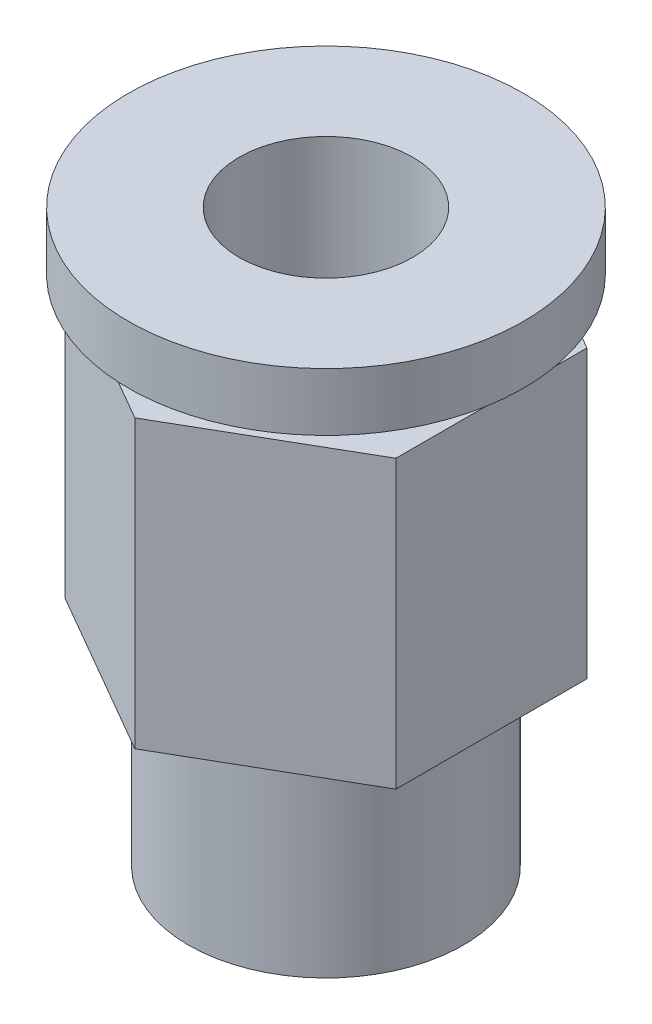
ISO-10303-21;
HEADER;
FILE_DESCRIPTION(('STEP AP214'),'2;1');
FILE_NAME('part.step','',(''),(''),'','','');
FILE_SCHEMA(('AUTOMOTIVE_DESIGN { 1 0 10303 214 1 1 1 1 }'));
ENDSEC;
DATA;
#1=APPLICATION_CONTEXT('core data for automotive mechanical design processes');
#2=APPLICATION_PROTOCOL_DEFINITION('international standard','automotive_design',2000,#1);
#3=PRODUCT_CONTEXT('',#1,'mechanical');
#4=PRODUCT('Part','Part','',(#3));
#5=PRODUCT_RELATED_PRODUCT_CATEGORY('part','',(#4));
#6=PRODUCT_DEFINITION_FORMATION('','',#4);
#7=PRODUCT_DEFINITION_CONTEXT('part definition',#1,'design');
#8=PRODUCT_DEFINITION('design','',#6,#7);
#9=PRODUCT_DEFINITION_SHAPE('','',#8);
#10=(LENGTH_UNIT() NAMED_UNIT(*) SI_UNIT(.MILLI.,.METRE.));
#11=(NAMED_UNIT(*) PLANE_ANGLE_UNIT() SI_UNIT($,.RADIAN.));
#12=(NAMED_UNIT(*) SI_UNIT($,.STERADIAN.) SOLID_ANGLE_UNIT());
#13=UNCERTAINTY_MEASURE_WITH_UNIT(LENGTH_MEASURE(1.E-05),#10,'distance_accuracy_value','');
#14=(GEOMETRIC_REPRESENTATION_CONTEXT(3) GLOBAL_UNCERTAINTY_ASSIGNED_CONTEXT((#13)) GLOBAL_UNIT_ASSIGNED_CONTEXT((#10,
#11,#12)) REPRESENTATION_CONTEXT('',''));
#15=CARTESIAN_POINT('',(0.,0.,0.));
#16=DIRECTION('',(0.,0.,1.));
#17=DIRECTION('',(1.,0.,0.));
#18=AXIS2_PLACEMENT_3D('',#15,#16,#17);
#19=CARTESIAN_POINT('',(-4.75,6.8,0.));
#20=DIRECTION('',(0.,1.,0.));
#21=DIRECTION('',(0.,0.,1.));
#22=AXIS2_PLACEMENT_3D('',#19,#20,#21);
#23=PLANE('',#22);
#24=CARTESIAN_POINT('',(0.,6.8,0.));
#25=DIRECTION('',(0.,-1.,0.));
#26=DIRECTION('',(0.,0.,-1.));
#27=AXIS2_PLACEMENT_3D('',#24,#25,#26);
#28=CIRCLE('',#27,4.75);
#29=CARTESIAN_POINT('',(0.,6.8,-4.75));
#30=VERTEX_POINT('',#29);
#31=EDGE_CURVE('E65',#30,#30,#28,.T.);
#32=ORIENTED_EDGE('',*,*,#31,.F.);
#33=EDGE_LOOP('',(#32));
#34=FACE_BOUND('',#33,.T.);
#35=DIRECTION('',(0.,0.,-1.));
#36=VECTOR('',#35,1.);
#37=CARTESIAN_POINT('',(-5.71576766497729,6.8,0.));
#38=LINE('',#37,#36);
#39=CARTESIAN_POINT('',(-5.7157676649773,6.8,3.29999999999999));
#40=VERTEX_POINT('',#39);
#41=CARTESIAN_POINT('',(-5.71576766497728,6.8,-3.30000000000003));
#42=VERTEX_POINT('',#41);
#43=EDGE_CURVE('E110',#40,#42,#38,.T.);
#44=ORIENTED_EDGE('',*,*,#43,.T.);
#45=DIRECTION('',(0.866025403784442,0.,-0.499999999999995));
#46=VECTOR('',#45,1.);
#47=CARTESIAN_POINT('',(-2.85788383248862,6.8,-4.95000000000001));
#48=LINE('',#47,#46);
#49=CARTESIAN_POINT('',(0.,6.8,-6.6));
#50=VERTEX_POINT('',#49);
#51=EDGE_CURVE('E116',#42,#50,#48,.T.);
#52=ORIENTED_EDGE('',*,*,#51,.T.);
#53=DIRECTION('',(0.866025403784435,0.,0.500000000000007));
#54=VECTOR('',#53,1.);
#55=CARTESIAN_POINT('',(2.85788383248869,6.8,-4.94999999999997));
#56=LINE('',#55,#54);
#57=CARTESIAN_POINT('',(5.71576766497732,6.8,-3.29999999999995));
#58=VERTEX_POINT('',#57);
#59=EDGE_CURVE('E309',#50,#58,#56,.T.);
#60=ORIENTED_EDGE('',*,*,#59,.T.);
#61=DIRECTION('',(0.,0.,1.));
#62=VECTOR('',#61,1.);
#63=CARTESIAN_POINT('',(5.71576766497729,6.8,0.));
#64=LINE('',#63,#62);
#65=CARTESIAN_POINT('',(5.71576766497726,6.8,3.30000000000007));
#66=VERTEX_POINT('',#65);
#67=EDGE_CURVE('E146',#58,#66,#64,.T.);
#68=ORIENTED_EDGE('',*,*,#67,.T.);
#69=DIRECTION('',(-0.866025403784442,0.,0.499999999999995));
#70=VECTOR('',#69,1.);
#71=CARTESIAN_POINT('',(2.85788383248863,6.8,4.95000000000003));
#72=LINE('',#71,#70);
#73=CARTESIAN_POINT('',(0.,6.8,6.6));
#74=VERTEX_POINT('',#73);
#75=EDGE_CURVE('E80',#66,#74,#72,.T.);
#76=ORIENTED_EDGE('',*,*,#75,.T.);
#77=DIRECTION('',(-0.866025403784438,0.,-0.500000000000001));
#78=VECTOR('',#77,1.);
#79=CARTESIAN_POINT('',(-2.85788383248865,6.8,4.94999999999999));
#80=LINE('',#79,#78);
#81=EDGE_CURVE('E124',#74,#40,#80,.T.);
#82=ORIENTED_EDGE('',*,*,#81,.T.);
#83=EDGE_LOOP('',(#44,#52,#60,#68,#76,#82));
#84=FACE_BOUND('',#83,.T.);
#85=ADVANCED_FACE('F57',(#34,#84),#23,.F.);
#86=CARTESIAN_POINT('',(-6.6,16.7,0.));
#87=DIRECTION('',(0.,-1.,0.));
#88=DIRECTION('',(0.,0.,-1.));
#89=AXIS2_PLACEMENT_3D('',#86,#87,#88);
#90=PLANE('',#89);
#91=CARTESIAN_POINT('',(0.,16.7,0.));
#92=DIRECTION('',(0.,-1.,0.));
#93=DIRECTION('',(0.,0.,-1.));
#94=AXIS2_PLACEMENT_3D('',#91,#92,#93);
#95=CIRCLE('',#94,4.);
#96=CARTESIAN_POINT('',(0.,16.7,-4.));
#97=VERTEX_POINT('',#96);
#98=EDGE_CURVE('E167',#97,#97,#95,.T.);
#99=ORIENTED_EDGE('',*,*,#98,.T.);
#100=EDGE_LOOP('',(#99));
#101=FACE_BOUND('',#100,.T.);
#102=DIRECTION('',(0.,0.,1.));
#103=VECTOR('',#102,1.);
#104=CARTESIAN_POINT('',(-5.71576766497729,16.7,0.));
#105=LINE('',#104,#103);
#106=CARTESIAN_POINT('',(-5.71576766497728,16.7,-3.30000000000003));
#107=VERTEX_POINT('',#106);
#108=CARTESIAN_POINT('',(-5.7157676649773,16.7,3.29999999999999));
#109=VERTEX_POINT('',#108);
#110=EDGE_CURVE('E72',#107,#109,#105,.T.);
#111=ORIENTED_EDGE('',*,*,#110,.T.);
#112=DIRECTION('',(0.866025403784438,0.,0.500000000000001));
#113=VECTOR('',#112,1.);
#114=CARTESIAN_POINT('',(-2.85788383248865,16.7,4.94999999999999));
#115=LINE('',#114,#113);
#116=CARTESIAN_POINT('',(0.,16.7,6.6));
#117=VERTEX_POINT('',#116);
#118=EDGE_CURVE('E143',#109,#117,#115,.T.);
#119=ORIENTED_EDGE('',*,*,#118,.T.);
#120=DIRECTION('',(0.866025403784442,0.,-0.499999999999995));
#121=VECTOR('',#120,1.);
#122=CARTESIAN_POINT('',(2.85788383248863,16.7,4.95000000000003));
#123=LINE('',#122,#121);
#124=CARTESIAN_POINT('',(5.71576766497726,16.7,3.30000000000007));
#125=VERTEX_POINT('',#124);
#126=EDGE_CURVE('E313',#117,#125,#123,.T.);
#127=ORIENTED_EDGE('',*,*,#126,.T.);
#128=DIRECTION('',(0.,0.,-1.));
#129=VECTOR('',#128,1.);
#130=CARTESIAN_POINT('',(5.71576766497729,16.7,0.));
#131=LINE('',#130,#129);
#132=CARTESIAN_POINT('',(5.71576766497732,16.7,-3.29999999999995));
#133=VERTEX_POINT('',#132);
#134=EDGE_CURVE('E130',#125,#133,#131,.T.);
#135=ORIENTED_EDGE('',*,*,#134,.T.);
#136=DIRECTION('',(-0.866025403784435,0.,-0.500000000000007));
#137=VECTOR('',#136,1.);
#138=CARTESIAN_POINT('',(2.85788383248869,16.7,-4.94999999999997));
#139=LINE('',#138,#137);
#140=CARTESIAN_POINT('',(0.,16.7,-6.6));
#141=VERTEX_POINT('',#140);
#142=EDGE_CURVE('E125',#133,#141,#139,.T.);
#143=ORIENTED_EDGE('',*,*,#142,.T.);
#144=DIRECTION('',(-0.866025403784441,0.,0.499999999999995));
#145=VECTOR('',#144,1.);
#146=CARTESIAN_POINT('',(-2.85788383248862,16.7,-4.95000000000001));
#147=LINE('',#146,#145);
#148=EDGE_CURVE('E117',#141,#107,#147,.T.);
#149=ORIENTED_EDGE('',*,*,#148,.T.);
#150=EDGE_LOOP('',(#111,#119,#127,#135,#143,#149));
#151=FACE_BOUND('',#150,.T.);
#152=ADVANCED_FACE('F175',(#101,#151),#90,.F.);
#153=CARTESIAN_POINT('',(-3.,0.,0.));
#154=DIRECTION('',(0.,1.,0.));
#155=DIRECTION('',(0.,0.,1.));
#156=AXIS2_PLACEMENT_3D('',#153,#154,#155);
#157=PLANE('',#156);
#158=CARTESIAN_POINT('',(0.,0.,0.));
#159=DIRECTION('',(0.,-1.,0.));
#160=DIRECTION('',(0.,0.,-1.));
#161=AXIS2_PLACEMENT_3D('',#158,#159,#160);
#162=CIRCLE('',#161,3.);
#163=CARTESIAN_POINT('',(0.,0.,-3.));
#164=VERTEX_POINT('',#163);
#165=EDGE_CURVE('E148',#164,#164,#162,.T.);
#166=ORIENTED_EDGE('',*,*,#165,.F.);
#167=EDGE_LOOP('',(#166));
#168=FACE_BOUND('',#167,.T.);
#169=CARTESIAN_POINT('',(0.,0.,0.));
#170=DIRECTION('',(0.,-1.,0.));
#171=DIRECTION('',(0.,0.,-1.));
#172=AXIS2_PLACEMENT_3D('',#169,#170,#171);
#173=CIRCLE('',#172,4.75);
#174=CARTESIAN_POINT('',(0.,0.,-4.75));
#175=VERTEX_POINT('',#174);
#176=EDGE_CURVE('E12',#175,#175,#173,.T.);
#177=ORIENTED_EDGE('',*,*,#176,.T.);
#178=EDGE_LOOP('',(#177));
#179=FACE_BOUND('',#178,.T.);
#180=ADVANCED_FACE('F59',(#168,#179),#157,.F.);
#181=CARTESIAN_POINT('',(0.,0.,0.));
#182=DIRECTION('',(0.,-1.,0.));
#183=DIRECTION('',(0.,0.,-1.));
#184=AXIS2_PLACEMENT_3D('',#181,#182,#183);
#185=CYLINDRICAL_SURFACE('',#184,4.75);
#186=ORIENTED_EDGE('',*,*,#176,.F.);
#187=EDGE_LOOP('',(#186));
#188=FACE_BOUND('',#187,.T.);
#189=ORIENTED_EDGE('',*,*,#31,.T.);
#190=EDGE_LOOP('',(#189));
#191=FACE_BOUND('',#190,.T.);
#192=ADVANCED_FACE('F172',(#188,#191),#185,.T.);
#193=CARTESIAN_POINT('',(0.,0.,0.));
#194=DIRECTION('',(0.,-1.,0.));
#195=DIRECTION('',(0.,0.,-1.));
#196=AXIS2_PLACEMENT_3D('',#193,#194,#195);
#197=CYLINDRICAL_SURFACE('',#196,4.);
#198=ORIENTED_EDGE('',*,*,#98,.F.);
#199=EDGE_LOOP('',(#198));
#200=FACE_BOUND('',#199,.T.);
#201=CARTESIAN_POINT('',(0.,17.7,0.));
#202=DIRECTION('',(0.,-1.,0.));
#203=DIRECTION('',(0.,0.,-1.));
#204=AXIS2_PLACEMENT_3D('',#201,#202,#203);
#205=CIRCLE('',#204,4.);
#206=CARTESIAN_POINT('',(0.,17.7,-4.));
#207=VERTEX_POINT('',#206);
#208=EDGE_CURVE('E164',#207,#207,#205,.T.);
#209=ORIENTED_EDGE('',*,*,#208,.T.);
#210=EDGE_LOOP('',(#209));
#211=FACE_BOUND('',#210,.T.);
#212=ADVANCED_FACE('F185',(#200,#211),#197,.T.);
#213=CARTESIAN_POINT('',(-4.,17.7,0.));
#214=DIRECTION('',(0.,1.,0.));
#215=DIRECTION('',(0.,0.,1.));
#216=AXIS2_PLACEMENT_3D('',#213,#214,#215);
#217=PLANE('',#216);
#218=ORIENTED_EDGE('',*,*,#208,.F.);
#219=EDGE_LOOP('',(#218));
#220=FACE_BOUND('',#219,.T.);
#221=CARTESIAN_POINT('',(0.,17.7,0.));
#222=DIRECTION('',(0.,-1.,0.));
#223=DIRECTION('',(0.,0.,-1.));
#224=AXIS2_PLACEMENT_3D('',#221,#222,#223);
#225=CIRCLE('',#224,6.825);
#226=CARTESIAN_POINT('',(0.,17.7,-6.825));
#227=VERTEX_POINT('',#226);
#228=EDGE_CURVE('E161',#227,#227,#225,.T.);
#229=ORIENTED_EDGE('',*,*,#228,.T.);
#230=EDGE_LOOP('',(#229));
#231=FACE_BOUND('',#230,.T.);
#232=ADVANCED_FACE('F191',(#220,#231),#217,.F.);
#233=CARTESIAN_POINT('',(0.,0.,0.));
#234=DIRECTION('',(0.,-1.,0.));
#235=DIRECTION('',(0.,0.,-1.));
#236=AXIS2_PLACEMENT_3D('',#233,#234,#235);
#237=CYLINDRICAL_SURFACE('',#236,6.825);
#238=ORIENTED_EDGE('',*,*,#228,.F.);
#239=EDGE_LOOP('',(#238));
#240=FACE_BOUND('',#239,.T.);
#241=CARTESIAN_POINT('',(0.,19.7,0.));
#242=DIRECTION('',(0.,-1.,0.));
#243=DIRECTION('',(0.,0.,-1.));
#244=AXIS2_PLACEMENT_3D('',#241,#242,#243);
#245=CIRCLE('',#244,6.825);
#246=CARTESIAN_POINT('',(0.,19.7,-6.825));
#247=VERTEX_POINT('',#246);
#248=EDGE_CURVE('E158',#247,#247,#245,.T.);
#249=ORIENTED_EDGE('',*,*,#248,.T.);
#250=EDGE_LOOP('',(#249));
#251=FACE_BOUND('',#250,.T.);
#252=ADVANCED_FACE('F213',(#240,#251),#237,.T.);
#253=CARTESIAN_POINT('',(-6.825,19.7,0.));
#254=DIRECTION('',(0.,-1.,0.));
#255=DIRECTION('',(0.,0.,-1.));
#256=AXIS2_PLACEMENT_3D('',#253,#254,#255);
#257=PLANE('',#256);
#258=ORIENTED_EDGE('',*,*,#248,.F.);
#259=EDGE_LOOP('',(#258));
#260=FACE_BOUND('',#259,.T.);
#261=CARTESIAN_POINT('',(0.,19.7,0.));
#262=DIRECTION('',(0.,-1.,0.));
#263=DIRECTION('',(0.,0.,-1.));
#264=AXIS2_PLACEMENT_3D('',#261,#262,#263);
#265=CIRCLE('',#264,3.);
#266=CARTESIAN_POINT('',(0.,19.7,-3.));
#267=VERTEX_POINT('',#266);
#268=EDGE_CURVE('E155',#267,#267,#265,.T.);
#269=ORIENTED_EDGE('',*,*,#268,.T.);
#270=EDGE_LOOP('',(#269));
#271=FACE_BOUND('',#270,.T.);
#272=ADVANCED_FACE('F203',(#260,#271),#257,.F.);
#273=CARTESIAN_POINT('',(0.,0.,0.));
#274=DIRECTION('',(0.,-1.,0.));
#275=DIRECTION('',(0.,0.,-1.));
#276=AXIS2_PLACEMENT_3D('',#273,#274,#275);
#277=CYLINDRICAL_SURFACE('',#276,3.);
#278=ORIENTED_EDGE('',*,*,#268,.F.);
#279=EDGE_LOOP('',(#278));
#280=FACE_BOUND('',#279,.T.);
#281=ORIENTED_EDGE('',*,*,#165,.T.);
#282=EDGE_LOOP('',(#281));
#283=FACE_BOUND('',#282,.T.);
#284=ADVANCED_FACE('F200',(#280,#283),#277,.F.);
#285=CARTESIAN_POINT('',(-2.85788383248865,19.701,4.94999999999999));
#286=DIRECTION('',(-0.500000000000001,0.,0.866025403784438));
#287=DIRECTION('',(0.866025403784438,0.,0.500000000000001));
#288=AXIS2_PLACEMENT_3D('',#285,#286,#287);
#289=PLANE('',#288);
#290=DIRECTION('',(0.,-1.,0.));
#291=VECTOR('',#290,1.);
#292=CARTESIAN_POINT('',(-5.7157676649773,19.701,3.29999999999999));
#293=LINE('',#292,#291);
#294=EDGE_CURVE('E141',#109,#40,#293,.T.);
#295=ORIENTED_EDGE('',*,*,#294,.T.);
#296=ORIENTED_EDGE('',*,*,#81,.F.);
#297=DIRECTION('',(0.,-1.,0.));
#298=VECTOR('',#297,1.);
#299=CARTESIAN_POINT('',(0.,19.701,6.6));
#300=LINE('',#299,#298);
#301=EDGE_CURVE('E142',#117,#74,#300,.T.);
#302=ORIENTED_EDGE('',*,*,#301,.F.);
#303=ORIENTED_EDGE('',*,*,#118,.F.);
#304=EDGE_LOOP('',(#295,#296,#302,#303));
#305=FACE_BOUND('',#304,.T.);
#306=ADVANCED_FACE('F202',(#305),#289,.T.);
#307=CARTESIAN_POINT('',(5.71576766497729,19.701,0.));
#308=DIRECTION('',(1.,0.,0.));
#309=DIRECTION('',(0.,0.,-1.));
#310=AXIS2_PLACEMENT_3D('',#307,#308,#309);
#311=PLANE('',#310);
#312=DIRECTION('',(0.,-1.,0.));
#313=VECTOR('',#312,1.);
#314=CARTESIAN_POINT('',(5.71576766497726,19.701,3.30000000000007));
#315=LINE('',#314,#313);
#316=EDGE_CURVE('E137',#125,#66,#315,.T.);
#317=ORIENTED_EDGE('',*,*,#316,.T.);
#318=ORIENTED_EDGE('',*,*,#67,.F.);
#319=DIRECTION('',(0.,-1.,0.));
#320=VECTOR('',#319,1.);
#321=CARTESIAN_POINT('',(5.71576766497732,19.701,-3.29999999999995));
#322=LINE('',#321,#320);
#323=EDGE_CURVE('E133',#133,#58,#322,.T.);
#324=ORIENTED_EDGE('',*,*,#323,.F.);
#325=ORIENTED_EDGE('',*,*,#134,.F.);
#326=EDGE_LOOP('',(#317,#318,#324,#325));
#327=FACE_BOUND('',#326,.T.);
#328=ADVANCED_FACE('F210',(#327),#311,.T.);
#329=CARTESIAN_POINT('',(-2.85788383248862,19.701,-4.95000000000001));
#330=DIRECTION('',(-0.499999999999995,0.,-0.866025403784441));
#331=DIRECTION('',(-0.866025403784441,0.,0.499999999999995));
#332=AXIS2_PLACEMENT_3D('',#329,#330,#331);
#333=PLANE('',#332);
#334=DIRECTION('',(0.,-1.,0.));
#335=VECTOR('',#334,1.);
#336=CARTESIAN_POINT('',(0.,19.701,-6.6));
#337=LINE('',#336,#335);
#338=EDGE_CURVE('E129',#141,#50,#337,.T.);
#339=ORIENTED_EDGE('',*,*,#338,.T.);
#340=ORIENTED_EDGE('',*,*,#51,.F.);
#341=DIRECTION('',(0.,-1.,0.));
#342=VECTOR('',#341,1.);
#343=CARTESIAN_POINT('',(-5.71576766497728,19.701,-3.30000000000003));
#344=LINE('',#343,#342);
#345=EDGE_CURVE('E107',#107,#42,#344,.T.);
#346=ORIENTED_EDGE('',*,*,#345,.F.);
#347=ORIENTED_EDGE('',*,*,#148,.F.);
#348=EDGE_LOOP('',(#339,#340,#346,#347));
#349=FACE_BOUND('',#348,.T.);
#350=ADVANCED_FACE('F128',(#349),#333,.T.);
#351=CARTESIAN_POINT('',(2.85788383248863,19.701,4.95000000000003));
#352=DIRECTION('',(0.499999999999995,0.,0.866025403784441));
#353=DIRECTION('',(0.866025403784442,0.,-0.499999999999995));
#354=AXIS2_PLACEMENT_3D('',#351,#352,#353);
#355=PLANE('',#354);
#356=ORIENTED_EDGE('',*,*,#301,.T.);
#357=ORIENTED_EDGE('',*,*,#75,.F.);
#358=ORIENTED_EDGE('',*,*,#316,.F.);
#359=ORIENTED_EDGE('',*,*,#126,.F.);
#360=EDGE_LOOP('',(#356,#357,#358,#359));
#361=FACE_BOUND('',#360,.T.);
#362=ADVANCED_FACE('F277',(#361),#355,.T.);
#363=CARTESIAN_POINT('',(2.85788383248869,19.701,-4.94999999999997));
#364=DIRECTION('',(0.500000000000007,0.,-0.866025403784434));
#365=DIRECTION('',(-0.866025403784435,0.,-0.500000000000007));
#366=AXIS2_PLACEMENT_3D('',#363,#364,#365);
#367=PLANE('',#366);
#368=ORIENTED_EDGE('',*,*,#323,.T.);
#369=ORIENTED_EDGE('',*,*,#59,.F.);
#370=ORIENTED_EDGE('',*,*,#338,.F.);
#371=ORIENTED_EDGE('',*,*,#142,.F.);
#372=EDGE_LOOP('',(#368,#369,#370,#371));
#373=FACE_BOUND('',#372,.T.);
#374=ADVANCED_FACE('F285',(#373),#367,.T.);
#375=CARTESIAN_POINT('',(-5.71576766497729,19.701,0.));
#376=DIRECTION('',(-1.,0.,0.));
#377=DIRECTION('',(0.,0.,1.));
#378=AXIS2_PLACEMENT_3D('',#375,#376,#377);
#379=PLANE('',#378);
#380=ORIENTED_EDGE('',*,*,#345,.T.);
#381=ORIENTED_EDGE('',*,*,#43,.F.);
#382=ORIENTED_EDGE('',*,*,#294,.F.);
#383=ORIENTED_EDGE('',*,*,#110,.F.);
#384=EDGE_LOOP('',(#380,#381,#382,#383));
#385=FACE_BOUND('',#384,.T.);
#386=ADVANCED_FACE('F109',(#385),#379,.T.);
#387=CLOSED_SHELL('',(#85,#152,#180,#192,#212,#232,#252,#272,#284,#306,#328,#350,#362,#374,#386));
#388=MANIFOLD_SOLID_BREP('B2',#387);
#389=ADVANCED_BREP_SHAPE_REPRESENTATION('',(#18,#388),#14);
#390=SHAPE_DEFINITION_REPRESENTATION(#9,#389);
ENDSEC;
END-ISO-10303-21;
